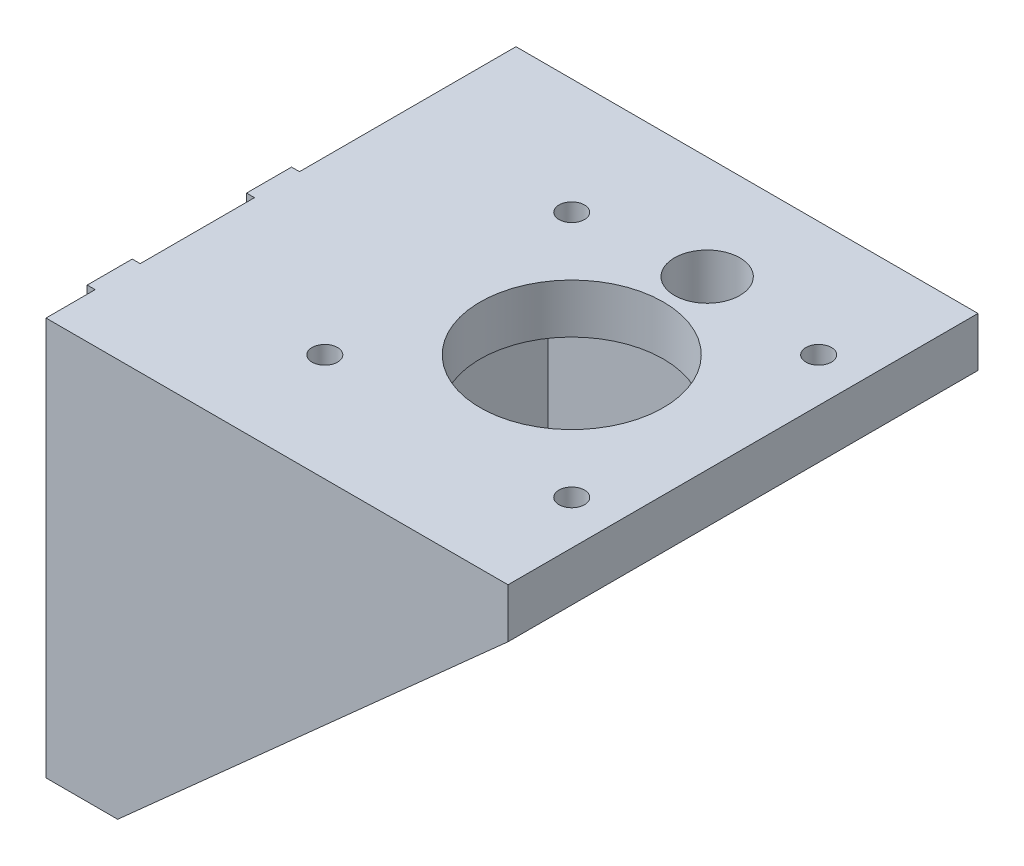
ISO-10303-21;
HEADER;
FILE_DESCRIPTION(('STEP AP214'),'2;1');
FILE_NAME('part.step','',(''),(''),'','','');
FILE_SCHEMA(('AUTOMOTIVE_DESIGN { 1 0 10303 214 1 1 1 1 }'));
ENDSEC;
DATA;
#1=APPLICATION_CONTEXT('core data for automotive mechanical design processes');
#2=APPLICATION_PROTOCOL_DEFINITION('international standard','automotive_design',2000,#1);
#3=PRODUCT_CONTEXT('',#1,'mechanical');
#4=PRODUCT('Part','Part','',(#3));
#5=PRODUCT_RELATED_PRODUCT_CATEGORY('part','',(#4));
#6=PRODUCT_DEFINITION_FORMATION('','',#4);
#7=PRODUCT_DEFINITION_CONTEXT('part definition',#1,'design');
#8=PRODUCT_DEFINITION('design','',#6,#7);
#9=PRODUCT_DEFINITION_SHAPE('','',#8);
#10=(LENGTH_UNIT() NAMED_UNIT(*) SI_UNIT(.MILLI.,.METRE.));
#11=(NAMED_UNIT(*) PLANE_ANGLE_UNIT() SI_UNIT($,.RADIAN.));
#12=(NAMED_UNIT(*) SI_UNIT($,.STERADIAN.) SOLID_ANGLE_UNIT());
#13=UNCERTAINTY_MEASURE_WITH_UNIT(LENGTH_MEASURE(1.E-05),#10,'distance_accuracy_value','');
#14=(GEOMETRIC_REPRESENTATION_CONTEXT(3) GLOBAL_UNCERTAINTY_ASSIGNED_CONTEXT((#13)) GLOBAL_UNIT_ASSIGNED_CONTEXT((#10,
#11,#12)) REPRESENTATION_CONTEXT('',''));
#15=CARTESIAN_POINT('',(0.,0.,0.));
#16=DIRECTION('',(0.,0.,1.));
#17=DIRECTION('',(1.,0.,0.));
#18=AXIS2_PLACEMENT_3D('',#15,#16,#17);
#19=CARTESIAN_POINT('',(0.,11.9,-49.));
#20=DIRECTION('',(1.,0.,0.));
#21=DIRECTION('',(0.,0.,1.));
#22=AXIS2_PLACEMENT_3D('',#19,#20,#21);
#23=CYLINDRICAL_SURFACE('',#22,1.75);
#24=CARTESIAN_POINT('',(-1.,11.9,-49.));
#25=DIRECTION('',(1.,0.,0.));
#26=DIRECTION('',(0.,0.,-1.));
#27=AXIS2_PLACEMENT_3D('',#24,#25,#26);
#28=CIRCLE('',#27,1.75);
#29=CARTESIAN_POINT('',(-1.,11.9,-50.75));
#30=VERTEX_POINT('',#29);
#31=EDGE_CURVE('E176',#30,#30,#28,.F.);
#32=ORIENTED_EDGE('',*,*,#31,.T.);
#33=EDGE_LOOP('',(#32));
#34=FACE_BOUND('',#33,.T.);
#35=CARTESIAN_POINT('',(5.,11.9,-49.));
#36=DIRECTION('',(-1.,0.,0.));
#37=DIRECTION('',(0.,0.,1.));
#38=AXIS2_PLACEMENT_3D('',#35,#36,#37);
#39=CIRCLE('',#38,1.75);
#40=CARTESIAN_POINT('',(5.,11.9,-47.25));
#41=VERTEX_POINT('',#40);
#42=EDGE_CURVE('E43',#41,#41,#39,.F.);
#43=ORIENTED_EDGE('',*,*,#42,.T.);
#44=EDGE_LOOP('',(#43));
#45=FACE_BOUND('',#44,.T.);
#46=ADVANCED_FACE('F39',(#34,#45),#23,.F.);
#47=CARTESIAN_POINT('',(0.,31.9,-49.));
#48=DIRECTION('',(1.,0.,0.));
#49=DIRECTION('',(0.,0.,1.));
#50=AXIS2_PLACEMENT_3D('',#47,#48,#49);
#51=CYLINDRICAL_SURFACE('',#50,1.75);
#52=CARTESIAN_POINT('',(-1.,31.9,-49.));
#53=DIRECTION('',(1.,0.,0.));
#54=DIRECTION('',(0.,0.,-1.));
#55=AXIS2_PLACEMENT_3D('',#52,#53,#54);
#56=CIRCLE('',#55,1.75);
#57=CARTESIAN_POINT('',(-1.,31.9,-50.75));
#58=VERTEX_POINT('',#57);
#59=EDGE_CURVE('E173',#58,#58,#56,.F.);
#60=ORIENTED_EDGE('',*,*,#59,.T.);
#61=EDGE_LOOP('',(#60));
#62=FACE_BOUND('',#61,.T.);
#63=CARTESIAN_POINT('',(5.,31.9,-49.));
#64=DIRECTION('',(-1.,0.,0.));
#65=DIRECTION('',(0.,0.,1.));
#66=AXIS2_PLACEMENT_3D('',#63,#64,#65);
#67=CIRCLE('',#66,1.75);
#68=CARTESIAN_POINT('',(5.,31.9,-47.25));
#69=VERTEX_POINT('',#68);
#70=EDGE_CURVE('E292',#69,#69,#67,.F.);
#71=ORIENTED_EDGE('',*,*,#70,.T.);
#72=EDGE_LOOP('',(#71));
#73=FACE_BOUND('',#72,.T.);
#74=ADVANCED_FACE('F319',(#62,#73),#51,.F.);
#75=CARTESIAN_POINT('',(0.,31.9,-29.));
#76=DIRECTION('',(1.,0.,0.));
#77=DIRECTION('',(0.,0.,1.));
#78=AXIS2_PLACEMENT_3D('',#75,#76,#77);
#79=CYLINDRICAL_SURFACE('',#78,1.75);
#80=CARTESIAN_POINT('',(-1.,31.9,-29.));
#81=DIRECTION('',(1.,0.,0.));
#82=DIRECTION('',(0.,0.,-1.));
#83=AXIS2_PLACEMENT_3D('',#80,#81,#82);
#84=CIRCLE('',#83,1.75);
#85=CARTESIAN_POINT('',(-1.,31.9,-30.75));
#86=VERTEX_POINT('',#85);
#87=EDGE_CURVE('E194',#86,#86,#84,.F.);
#88=ORIENTED_EDGE('',*,*,#87,.T.);
#89=EDGE_LOOP('',(#88));
#90=FACE_BOUND('',#89,.T.);
#91=CARTESIAN_POINT('',(5.,31.9,-29.));
#92=DIRECTION('',(-1.,0.,0.));
#93=DIRECTION('',(0.,0.,1.));
#94=AXIS2_PLACEMENT_3D('',#91,#92,#93);
#95=CIRCLE('',#94,1.75);
#96=CARTESIAN_POINT('',(5.,31.9,-27.25));
#97=VERTEX_POINT('',#96);
#98=EDGE_CURVE('E289',#97,#97,#95,.F.);
#99=ORIENTED_EDGE('',*,*,#98,.T.);
#100=EDGE_LOOP('',(#99));
#101=FACE_BOUND('',#100,.T.);
#102=ADVANCED_FACE('F325',(#90,#101),#79,.F.);
#103=CARTESIAN_POINT('',(0.,11.9,-29.));
#104=DIRECTION('',(1.,0.,0.));
#105=DIRECTION('',(0.,0.,1.));
#106=AXIS2_PLACEMENT_3D('',#103,#104,#105);
#107=CYLINDRICAL_SURFACE('',#106,1.75);
#108=CARTESIAN_POINT('',(-1.,11.9,-29.));
#109=DIRECTION('',(1.,0.,0.));
#110=DIRECTION('',(0.,0.,-1.));
#111=AXIS2_PLACEMENT_3D('',#108,#109,#110);
#112=CIRCLE('',#111,1.75);
#113=CARTESIAN_POINT('',(-1.,11.9,-30.75));
#114=VERTEX_POINT('',#113);
#115=EDGE_CURVE('E191',#114,#114,#112,.F.);
#116=ORIENTED_EDGE('',*,*,#115,.T.);
#117=EDGE_LOOP('',(#116));
#118=FACE_BOUND('',#117,.T.);
#119=CARTESIAN_POINT('',(5.,11.9,-29.));
#120=DIRECTION('',(-1.,0.,0.));
#121=DIRECTION('',(0.,0.,1.));
#122=AXIS2_PLACEMENT_3D('',#119,#120,#121);
#123=CIRCLE('',#122,1.75);
#124=CARTESIAN_POINT('',(5.,11.9,-27.25));
#125=VERTEX_POINT('',#124);
#126=EDGE_CURVE('E286',#125,#125,#123,.F.);
#127=ORIENTED_EDGE('',*,*,#126,.T.);
#128=EDGE_LOOP('',(#127));
#129=FACE_BOUND('',#128,.T.);
#130=ADVANCED_FACE('F331',(#118,#129),#107,.F.);
#131=CARTESIAN_POINT('',(0.,50.,-79.));
#132=DIRECTION('',(1.,0.,0.));
#133=DIRECTION('',(0.,0.,1.));
#134=AXIS2_PLACEMENT_3D('',#131,#132,#133);
#135=PLANE('',#134);
#136=DIRECTION('',(0.,1.,0.));
#137=VECTOR('',#136,1.);
#138=CARTESIAN_POINT('',(0.,0.,-51.825));
#139=LINE('',#138,#137);
#140=CARTESIAN_POINT('',(0.,0.,-51.825));
#141=VERTEX_POINT('',#140);
#142=CARTESIAN_POINT('',(0.,50.,-51.825));
#143=VERTEX_POINT('',#142);
#144=EDGE_CURVE('E168',#141,#143,#139,.T.);
#145=ORIENTED_EDGE('',*,*,#144,.T.);
#146=DIRECTION('',(0.,0.,1.));
#147=VECTOR('',#146,1.);
#148=CARTESIAN_POINT('',(0.,50.,-79.));
#149=LINE('',#148,#147);
#150=CARTESIAN_POINT('',(0.,50.,-79.));
#151=VERTEX_POINT('',#150);
#152=EDGE_CURVE('E265',#151,#143,#149,.T.);
#153=ORIENTED_EDGE('',*,*,#152,.F.);
#154=DIRECTION('',(0.,-1.,0.));
#155=VECTOR('',#154,1.);
#156=CARTESIAN_POINT('',(0.,50.,-79.));
#157=LINE('',#156,#155);
#158=CARTESIAN_POINT('',(0.,0.,-79.));
#159=VERTEX_POINT('',#158);
#160=EDGE_CURVE('E238',#151,#159,#157,.T.);
#161=ORIENTED_EDGE('',*,*,#160,.T.);
#162=DIRECTION('',(0.,0.,1.));
#163=VECTOR('',#162,1.);
#164=CARTESIAN_POINT('',(0.,0.,-79.));
#165=LINE('',#164,#163);
#166=EDGE_CURVE('E281',#159,#141,#165,.T.);
#167=ORIENTED_EDGE('',*,*,#166,.T.);
#168=EDGE_LOOP('',(#145,#153,#161,#167));
#169=FACE_BOUND('',#168,.T.);
#170=ADVANCED_FACE('F380',(#169),#135,.F.);
#171=DIRECTION('',(0.,-1.,0.));
#172=VECTOR('',#171,1.);
#173=CARTESIAN_POINT('',(0.,0.,-46.175));
#174=LINE('',#173,#172);
#175=CARTESIAN_POINT('',(0.,50.,-46.175));
#176=VERTEX_POINT('',#175);
#177=CARTESIAN_POINT('',(0.,0.,-46.175));
#178=VERTEX_POINT('',#177);
#179=EDGE_CURVE('E184',#176,#178,#174,.T.);
#180=ORIENTED_EDGE('',*,*,#179,.T.);
#181=CARTESIAN_POINT('',(0.,0.,-31.825));
#182=VERTEX_POINT('',#181);
#183=EDGE_CURVE('E283',#178,#182,#165,.T.);
#184=ORIENTED_EDGE('',*,*,#183,.T.);
#185=DIRECTION('',(0.,1.,0.));
#186=VECTOR('',#185,1.);
#187=CARTESIAN_POINT('',(0.,0.,-31.825));
#188=LINE('',#187,#186);
#189=CARTESIAN_POINT('',(0.,50.,-31.825));
#190=VERTEX_POINT('',#189);
#191=EDGE_CURVE('E169',#182,#190,#188,.T.);
#192=ORIENTED_EDGE('',*,*,#191,.T.);
#193=EDGE_CURVE('E269',#176,#190,#149,.T.);
#194=ORIENTED_EDGE('',*,*,#193,.F.);
#195=EDGE_LOOP('',(#180,#184,#192,#194));
#196=FACE_BOUND('',#195,.T.);
#197=ADVANCED_FACE('F378',(#196),#135,.F.);
#198=DIRECTION('',(0.,-1.,0.));
#199=VECTOR('',#198,1.);
#200=CARTESIAN_POINT('',(0.,0.,-26.175));
#201=LINE('',#200,#199);
#202=CARTESIAN_POINT('',(0.,50.,-26.175));
#203=VERTEX_POINT('',#202);
#204=CARTESIAN_POINT('',(0.,0.,-26.175));
#205=VERTEX_POINT('',#204);
#206=EDGE_CURVE('E195',#203,#205,#201,.T.);
#207=ORIENTED_EDGE('',*,*,#206,.T.);
#208=CARTESIAN_POINT('',(0.,0.,-20.));
#209=VERTEX_POINT('',#208);
#210=EDGE_CURVE('E280',#205,#209,#165,.T.);
#211=ORIENTED_EDGE('',*,*,#210,.T.);
#212=DIRECTION('',(0.,-1.,0.));
#213=VECTOR('',#212,1.);
#214=CARTESIAN_POINT('',(0.,50.,-20.));
#215=LINE('',#214,#213);
#216=CARTESIAN_POINT('',(0.,50.,-20.));
#217=VERTEX_POINT('',#216);
#218=EDGE_CURVE('E237',#217,#209,#215,.T.);
#219=ORIENTED_EDGE('',*,*,#218,.F.);
#220=EDGE_CURVE('E252',#203,#217,#149,.T.);
#221=ORIENTED_EDGE('',*,*,#220,.F.);
#222=EDGE_LOOP('',(#207,#211,#219,#221));
#223=FACE_BOUND('',#222,.T.);
#224=ADVANCED_FACE('F41',(#223),#135,.F.);
#225=CARTESIAN_POINT('',(8.99999999999999,0.,-79.));
#226=DIRECTION('',(-0.666438974816623,0.745559583698961,0.));
#227=DIRECTION('',(-0.745559583698961,-0.666438974816623,0.));
#228=AXIS2_PLACEMENT_3D('',#225,#226,#227);
#229=PLANE('',#228);
#230=DIRECTION('',(0.,0.,1.));
#231=VECTOR('',#230,1.);
#232=CARTESIAN_POINT('',(8.99999999999999,0.,-79.));
#233=LINE('',#232,#231);
#234=CARTESIAN_POINT('',(8.99999999999999,0.,-79.));
#235=VERTEX_POINT('',#234);
#236=CARTESIAN_POINT('',(8.99999999999999,0.,-74.));
#237=VERTEX_POINT('',#236);
#238=EDGE_CURVE('E277',#235,#237,#233,.T.);
#239=ORIENTED_EDGE('',*,*,#238,.F.);
#240=DIRECTION('',(0.745559583698961,0.666438974816623,0.));
#241=VECTOR('',#240,1.);
#242=CARTESIAN_POINT('',(8.99999999999999,0.,-79.));
#243=LINE('',#242,#241);
#244=CARTESIAN_POINT('',(58.,43.8,-79.));
#245=VERTEX_POINT('',#244);
#246=EDGE_CURVE('E244',#235,#245,#243,.T.);
#247=ORIENTED_EDGE('',*,*,#246,.T.);
#248=DIRECTION('',(0.,0.,1.));
#249=VECTOR('',#248,1.);
#250=CARTESIAN_POINT('',(58.,43.8,-79.));
#251=LINE('',#250,#249);
#252=CARTESIAN_POINT('',(58.,43.8,-74.));
#253=VERTEX_POINT('',#252);
#254=EDGE_CURVE('E273',#245,#253,#251,.T.);
#255=ORIENTED_EDGE('',*,*,#254,.T.);
#256=DIRECTION('',(0.745559583698961,0.666438974816623,0.));
#257=VECTOR('',#256,1.);
#258=CARTESIAN_POINT('',(8.99999999999999,0.,-74.));
#259=LINE('',#258,#257);
#260=EDGE_CURVE('E12',#237,#253,#259,.T.);
#261=ORIENTED_EDGE('',*,*,#260,.F.);
#262=EDGE_LOOP('',(#239,#247,#255,#261));
#263=FACE_BOUND('',#262,.T.);
#264=ADVANCED_FACE('F369',(#263),#229,.F.);
#265=CARTESIAN_POINT('',(0.,0.,-79.));
#266=DIRECTION('',(0.,1.,0.));
#267=DIRECTION('',(0.,0.,-1.));
#268=AXIS2_PLACEMENT_3D('',#265,#266,#267);
#269=PLANE('',#268);
#270=DIRECTION('',(1.,0.,0.));
#271=VECTOR('',#270,1.);
#272=CARTESIAN_POINT('',(0.,0.,-20.));
#273=LINE('',#272,#271);
#274=CARTESIAN_POINT('',(8.99999999999999,0.,-20.));
#275=VERTEX_POINT('',#274);
#276=EDGE_CURVE('E255',#209,#275,#273,.T.);
#277=ORIENTED_EDGE('',*,*,#276,.F.);
#278=ORIENTED_EDGE('',*,*,#210,.F.);
#279=DIRECTION('',(1.,0.,0.));
#280=VECTOR('',#279,1.);
#281=CARTESIAN_POINT('',(-1.,0.,-26.175));
#282=LINE('',#281,#280);
#283=CARTESIAN_POINT('',(-1.,0.,-26.175));
#284=VERTEX_POINT('',#283);
#285=EDGE_CURVE('E208',#284,#205,#282,.T.);
#286=ORIENTED_EDGE('',*,*,#285,.F.);
#287=DIRECTION('',(0.,0.,-1.));
#288=VECTOR('',#287,1.);
#289=CARTESIAN_POINT('',(-1.,0.,-20.));
#290=LINE('',#289,#288);
#291=CARTESIAN_POINT('',(-1.,0.,-31.825));
#292=VERTEX_POINT('',#291);
#293=EDGE_CURVE('E198',#284,#292,#290,.T.);
#294=ORIENTED_EDGE('',*,*,#293,.T.);
#295=DIRECTION('',(1.,0.,0.));
#296=VECTOR('',#295,1.);
#297=CARTESIAN_POINT('',(-1.,0.,-31.825));
#298=LINE('',#297,#296);
#299=EDGE_CURVE('E218',#292,#182,#298,.T.);
#300=ORIENTED_EDGE('',*,*,#299,.T.);
#301=ORIENTED_EDGE('',*,*,#183,.F.);
#302=DIRECTION('',(1.,0.,0.));
#303=VECTOR('',#302,1.);
#304=CARTESIAN_POINT('',(-1.,0.,-46.175));
#305=LINE('',#304,#303);
#306=CARTESIAN_POINT('',(-1.,0.,-46.175));
#307=VERTEX_POINT('',#306);
#308=EDGE_CURVE('E56',#307,#178,#305,.T.);
#309=ORIENTED_EDGE('',*,*,#308,.F.);
#310=DIRECTION('',(0.,0.,-1.));
#311=VECTOR('',#310,1.);
#312=CARTESIAN_POINT('',(-1.,0.,-20.));
#313=LINE('',#312,#311);
#314=CARTESIAN_POINT('',(-1.,0.,-51.825));
#315=VERTEX_POINT('',#314);
#316=EDGE_CURVE('E159',#307,#315,#313,.T.);
#317=ORIENTED_EDGE('',*,*,#316,.T.);
#318=DIRECTION('',(1.,0.,0.));
#319=VECTOR('',#318,1.);
#320=CARTESIAN_POINT('',(-1.,0.,-51.825));
#321=LINE('',#320,#319);
#322=EDGE_CURVE('E64',#315,#141,#321,.T.);
#323=ORIENTED_EDGE('',*,*,#322,.T.);
#324=ORIENTED_EDGE('',*,*,#166,.F.);
#325=DIRECTION('',(1.,0.,0.));
#326=VECTOR('',#325,1.);
#327=CARTESIAN_POINT('',(0.,0.,-79.));
#328=LINE('',#327,#326);
#329=EDGE_CURVE('E241',#159,#235,#328,.T.);
#330=ORIENTED_EDGE('',*,*,#329,.T.);
#331=ORIENTED_EDGE('',*,*,#238,.T.);
#332=DIRECTION('',(0.,0.,-1.));
#333=VECTOR('',#332,1.);
#334=CARTESIAN_POINT('',(8.99999999999999,0.,-24.));
#335=LINE('',#334,#333);
#336=CARTESIAN_POINT('',(8.99999999999997,0.,-24.));
#337=VERTEX_POINT('',#336);
#338=EDGE_CURVE('E229',#337,#237,#335,.T.);
#339=ORIENTED_EDGE('',*,*,#338,.F.);
#340=EDGE_CURVE('E276',#337,#275,#233,.T.);
#341=ORIENTED_EDGE('',*,*,#340,.T.);
#342=EDGE_LOOP('',(#277,#278,#286,#294,#300,#301,#309,#317,#323,#324,#330,#331,#339,#341));
#343=FACE_BOUND('',#342,.T.);
#344=ADVANCED_FACE('F172',(#343),#269,.F.);
#345=CARTESIAN_POINT('',(58.,43.8,-24.));
#346=VERTEX_POINT('',#345);
#347=CARTESIAN_POINT('',(58.,43.8,-20.));
#348=VERTEX_POINT('',#347);
#349=EDGE_CURVE('E272',#346,#348,#251,.T.);
#350=ORIENTED_EDGE('',*,*,#349,.T.);
#351=DIRECTION('',(0.745559583698961,0.666438974816623,0.));
#352=VECTOR('',#351,1.);
#353=CARTESIAN_POINT('',(8.99999999999999,0.,-20.));
#354=LINE('',#353,#352);
#355=EDGE_CURVE('E258',#275,#348,#354,.T.);
#356=ORIENTED_EDGE('',*,*,#355,.F.);
#357=ORIENTED_EDGE('',*,*,#340,.F.);
#358=DIRECTION('',(-0.745559583698961,-0.666438974816623,0.));
#359=VECTOR('',#358,1.);
#360=CARTESIAN_POINT('',(9.,0.,-24.));
#361=LINE('',#360,#359);
#362=EDGE_CURVE('E48',#346,#337,#361,.T.);
#363=ORIENTED_EDGE('',*,*,#362,.F.);
#364=EDGE_LOOP('',(#350,#356,#357,#363));
#365=FACE_BOUND('',#364,.T.);
#366=ADVANCED_FACE('F365',(#365),#229,.F.);
#367=CARTESIAN_POINT('',(58.,50.,-79.));
#368=DIRECTION('',(-1.,0.,0.));
#369=DIRECTION('',(0.,0.,-1.));
#370=AXIS2_PLACEMENT_3D('',#367,#368,#369);
#371=PLANE('',#370);
#372=DIRECTION('',(0.,1.,0.));
#373=VECTOR('',#372,1.);
#374=CARTESIAN_POINT('',(58.,50.,-20.));
#375=LINE('',#374,#373);
#376=CARTESIAN_POINT('',(58.,50.,-20.));
#377=VERTEX_POINT('',#376);
#378=EDGE_CURVE('E261',#348,#377,#375,.T.);
#379=ORIENTED_EDGE('',*,*,#378,.F.);
#380=ORIENTED_EDGE('',*,*,#349,.F.);
#381=DIRECTION('',(0.,0.,-1.));
#382=VECTOR('',#381,1.);
#383=CARTESIAN_POINT('',(58.,43.8,-74.));
#384=LINE('',#383,#382);
#385=EDGE_CURVE('E220',#346,#253,#384,.T.);
#386=ORIENTED_EDGE('',*,*,#385,.T.);
#387=ORIENTED_EDGE('',*,*,#254,.F.);
#388=DIRECTION('',(0.,1.,0.));
#389=VECTOR('',#388,1.);
#390=CARTESIAN_POINT('',(58.,50.,-79.));
#391=LINE('',#390,#389);
#392=CARTESIAN_POINT('',(58.,50.,-79.));
#393=VERTEX_POINT('',#392);
#394=EDGE_CURVE('E247',#245,#393,#391,.T.);
#395=ORIENTED_EDGE('',*,*,#394,.T.);
#396=DIRECTION('',(0.,0.,1.));
#397=VECTOR('',#396,1.);
#398=CARTESIAN_POINT('',(58.,50.,-79.));
#399=LINE('',#398,#397);
#400=EDGE_CURVE('E268',#393,#377,#399,.T.);
#401=ORIENTED_EDGE('',*,*,#400,.T.);
#402=EDGE_LOOP('',(#379,#380,#386,#387,#395,#401));
#403=FACE_BOUND('',#402,.T.);
#404=ADVANCED_FACE('F361',(#403),#371,.F.);
#405=CARTESIAN_POINT('',(0.,50.,-79.));
#406=DIRECTION('',(0.,-1.,0.));
#407=DIRECTION('',(0.,0.,1.));
#408=AXIS2_PLACEMENT_3D('',#405,#406,#407);
#409=PLANE('',#408);
#410=CARTESIAN_POINT('',(21.5,50.,-33.5));
#411=DIRECTION('',(0.,-1.,0.));
#412=DIRECTION('',(0.,0.,-1.));
#413=AXIS2_PLACEMENT_3D('',#410,#411,#412);
#414=CIRCLE('',#413,1.6);
#415=CARTESIAN_POINT('',(21.5,50.,-35.1));
#416=VERTEX_POINT('',#415);
#417=EDGE_CURVE('E503',#416,#416,#414,.T.);
#418=ORIENTED_EDGE('',*,*,#417,.T.);
#419=EDGE_LOOP('',(#418));
#420=FACE_BOUND('',#419,.T.);
#421=CARTESIAN_POINT('',(52.5,50.,-33.5));
#422=DIRECTION('',(0.,-1.,0.));
#423=DIRECTION('',(0.,0.,-1.));
#424=AXIS2_PLACEMENT_3D('',#421,#422,#423);
#425=CIRCLE('',#424,1.6);
#426=CARTESIAN_POINT('',(52.5,50.,-35.1));
#427=VERTEX_POINT('',#426);
#428=EDGE_CURVE('E511',#427,#427,#425,.T.);
#429=ORIENTED_EDGE('',*,*,#428,.T.);
#430=EDGE_LOOP('',(#429));
#431=FACE_BOUND('',#430,.T.);
#432=CARTESIAN_POINT('',(52.5,50.,-64.5));
#433=DIRECTION('',(0.,-1.,0.));
#434=DIRECTION('',(0.,0.,-1.));
#435=AXIS2_PLACEMENT_3D('',#432,#433,#434);
#436=CIRCLE('',#435,1.6);
#437=CARTESIAN_POINT('',(52.5,50.,-66.1));
#438=VERTEX_POINT('',#437);
#439=EDGE_CURVE('E517',#438,#438,#436,.T.);
#440=ORIENTED_EDGE('',*,*,#439,.T.);
#441=EDGE_LOOP('',(#440));
#442=FACE_BOUND('',#441,.T.);
#443=CARTESIAN_POINT('',(21.5,50.,-64.5));
#444=DIRECTION('',(0.,-1.,0.));
#445=DIRECTION('',(0.,0.,-1.));
#446=AXIS2_PLACEMENT_3D('',#443,#444,#445);
#447=CIRCLE('',#446,1.6);
#448=CARTESIAN_POINT('',(21.5,50.,-66.1));
#449=VERTEX_POINT('',#448);
#450=EDGE_CURVE('E500',#449,#449,#447,.T.);
#451=ORIENTED_EDGE('',*,*,#450,.T.);
#452=EDGE_LOOP('',(#451));
#453=FACE_BOUND('',#452,.T.);
#454=CARTESIAN_POINT('',(37.,50.,-66.));
#455=DIRECTION('',(0.,-1.,0.));
#456=DIRECTION('',(0.,0.,-1.));
#457=AXIS2_PLACEMENT_3D('',#454,#455,#456);
#458=CIRCLE('',#457,4.1);
#459=CARTESIAN_POINT('',(37.,50.,-70.1));
#460=VERTEX_POINT('',#459);
#461=EDGE_CURVE('E497',#460,#460,#458,.T.);
#462=ORIENTED_EDGE('',*,*,#461,.T.);
#463=EDGE_LOOP('',(#462));
#464=FACE_BOUND('',#463,.T.);
#465=CARTESIAN_POINT('',(37.,50.,-49.));
#466=DIRECTION('',(0.,-1.,0.));
#467=DIRECTION('',(0.,0.,-1.));
#468=AXIS2_PLACEMENT_3D('',#465,#466,#467);
#469=CIRCLE('',#468,11.5);
#470=CARTESIAN_POINT('',(37.,50.,-60.5));
#471=VERTEX_POINT('',#470);
#472=EDGE_CURVE('E510',#471,#471,#469,.T.);
#473=ORIENTED_EDGE('',*,*,#472,.T.);
#474=EDGE_LOOP('',(#473));
#475=FACE_BOUND('',#474,.T.);
#476=DIRECTION('',(-1.,0.,0.));
#477=VECTOR('',#476,1.);
#478=CARTESIAN_POINT('',(0.,50.,-20.));
#479=LINE('',#478,#477);
#480=EDGE_CURVE('E242',#377,#217,#479,.T.);
#481=ORIENTED_EDGE('',*,*,#480,.F.);
#482=ORIENTED_EDGE('',*,*,#400,.F.);
#483=DIRECTION('',(-1.,0.,0.));
#484=VECTOR('',#483,1.);
#485=CARTESIAN_POINT('',(0.,50.,-79.));
#486=LINE('',#485,#484);
#487=EDGE_CURVE('E250',#393,#151,#486,.T.);
#488=ORIENTED_EDGE('',*,*,#487,.T.);
#489=ORIENTED_EDGE('',*,*,#152,.T.);
#490=DIRECTION('',(1.,0.,0.));
#491=VECTOR('',#490,1.);
#492=CARTESIAN_POINT('',(-1.,50.,-51.825));
#493=LINE('',#492,#491);
#494=CARTESIAN_POINT('',(-1.,50.,-51.825));
#495=VERTEX_POINT('',#494);
#496=EDGE_CURVE('E170',#495,#143,#493,.T.);
#497=ORIENTED_EDGE('',*,*,#496,.F.);
#498=DIRECTION('',(0.,0.,1.));
#499=VECTOR('',#498,1.);
#500=CARTESIAN_POINT('',(-1.,50.,-20.));
#501=LINE('',#500,#499);
#502=CARTESIAN_POINT('',(-1.,50.,-46.175));
#503=VERTEX_POINT('',#502);
#504=EDGE_CURVE('E161',#495,#503,#501,.T.);
#505=ORIENTED_EDGE('',*,*,#504,.T.);
#506=DIRECTION('',(1.,0.,0.));
#507=VECTOR('',#506,1.);
#508=CARTESIAN_POINT('',(-1.,50.,-46.175));
#509=LINE('',#508,#507);
#510=EDGE_CURVE('E188',#503,#176,#509,.T.);
#511=ORIENTED_EDGE('',*,*,#510,.T.);
#512=ORIENTED_EDGE('',*,*,#193,.T.);
#513=DIRECTION('',(1.,0.,0.));
#514=VECTOR('',#513,1.);
#515=CARTESIAN_POINT('',(-1.,50.,-31.825));
#516=LINE('',#515,#514);
#517=CARTESIAN_POINT('',(-1.,50.,-31.825));
#518=VERTEX_POINT('',#517);
#519=EDGE_CURVE('E216',#518,#190,#516,.T.);
#520=ORIENTED_EDGE('',*,*,#519,.F.);
#521=DIRECTION('',(0.,0.,1.));
#522=VECTOR('',#521,1.);
#523=CARTESIAN_POINT('',(-1.,50.,-20.));
#524=LINE('',#523,#522);
#525=CARTESIAN_POINT('',(-1.,50.,-26.175));
#526=VERTEX_POINT('',#525);
#527=EDGE_CURVE('E203',#518,#526,#524,.T.);
#528=ORIENTED_EDGE('',*,*,#527,.T.);
#529=DIRECTION('',(1.,0.,0.));
#530=VECTOR('',#529,1.);
#531=CARTESIAN_POINT('',(-1.,50.,-26.175));
#532=LINE('',#531,#530);
#533=EDGE_CURVE('E214',#526,#203,#532,.T.);
#534=ORIENTED_EDGE('',*,*,#533,.T.);
#535=ORIENTED_EDGE('',*,*,#220,.T.);
#536=EDGE_LOOP('',(#481,#482,#488,#489,#497,#505,#511,#512,#520,#528,#534,#535));
#537=FACE_BOUND('',#536,.T.);
#538=ADVANCED_FACE('F354',(#420,#431,#442,#453,#464,#475,#537),#409,.F.);
#539=CARTESIAN_POINT('',(0.,0.,-79.));
#540=DIRECTION('',(0.,0.,-1.));
#541=DIRECTION('',(1.,0.,0.));
#542=AXIS2_PLACEMENT_3D('',#539,#540,#541);
#543=PLANE('',#542);
#544=ORIENTED_EDGE('',*,*,#160,.F.);
#545=ORIENTED_EDGE('',*,*,#487,.F.);
#546=ORIENTED_EDGE('',*,*,#394,.F.);
#547=ORIENTED_EDGE('',*,*,#246,.F.);
#548=ORIENTED_EDGE('',*,*,#329,.F.);
#549=EDGE_LOOP('',(#544,#545,#546,#547,#548));
#550=FACE_BOUND('',#549,.T.);
#551=ADVANCED_FACE('F351',(#550),#543,.T.);
#552=CARTESIAN_POINT('',(0.,0.,-20.));
#553=DIRECTION('',(0.,0.,-1.));
#554=DIRECTION('',(1.,0.,0.));
#555=AXIS2_PLACEMENT_3D('',#552,#553,#554);
#556=PLANE('',#555);
#557=ORIENTED_EDGE('',*,*,#218,.T.);
#558=ORIENTED_EDGE('',*,*,#276,.T.);
#559=ORIENTED_EDGE('',*,*,#355,.T.);
#560=ORIENTED_EDGE('',*,*,#378,.T.);
#561=ORIENTED_EDGE('',*,*,#480,.T.);
#562=EDGE_LOOP('',(#557,#558,#559,#560,#561));
#563=FACE_BOUND('',#562,.T.);
#564=ADVANCED_FACE('F349',(#563),#556,.F.);
#565=CARTESIAN_POINT('',(-66.4713472106591,0.,-74.));
#566=DIRECTION('',(0.,0.,-1.));
#567=DIRECTION('',(1.,0.,0.));
#568=AXIS2_PLACEMENT_3D('',#565,#566,#567);
#569=PLANE('',#568);
#570=DIRECTION('',(0.,1.,0.));
#571=VECTOR('',#570,1.);
#572=CARTESIAN_POINT('',(8.99999999999999,0.,-74.));
#573=LINE('',#572,#571);
#574=CARTESIAN_POINT('',(8.99999999999999,43.8,-74.));
#575=VERTEX_POINT('',#574);
#576=EDGE_CURVE('E226',#237,#575,#573,.T.);
#577=ORIENTED_EDGE('',*,*,#576,.F.);
#578=ORIENTED_EDGE('',*,*,#260,.T.);
#579=DIRECTION('',(1.,0.,0.));
#580=VECTOR('',#579,1.);
#581=CARTESIAN_POINT('',(-66.4713472106591,43.8,-74.));
#582=LINE('',#581,#580);
#583=EDGE_CURVE('E224',#575,#253,#582,.T.);
#584=ORIENTED_EDGE('',*,*,#583,.F.);
#585=EDGE_LOOP('',(#577,#578,#584));
#586=FACE_BOUND('',#585,.T.);
#587=ADVANCED_FACE('F345',(#586),#569,.F.);
#588=CARTESIAN_POINT('',(-66.4713472106591,43.8,-24.));
#589=DIRECTION('',(0.,0.,1.));
#590=DIRECTION('',(0.,1.,0.));
#591=AXIS2_PLACEMENT_3D('',#588,#589,#590);
#592=PLANE('',#591);
#593=DIRECTION('',(1.,0.,0.));
#594=VECTOR('',#593,1.);
#595=CARTESIAN_POINT('',(-66.4713472106591,43.8,-24.));
#596=LINE('',#595,#594);
#597=CARTESIAN_POINT('',(8.99999999999999,43.8,-24.));
#598=VERTEX_POINT('',#597);
#599=EDGE_CURVE('E232',#598,#346,#596,.T.);
#600=ORIENTED_EDGE('',*,*,#599,.T.);
#601=ORIENTED_EDGE('',*,*,#362,.T.);
#602=DIRECTION('',(0.,-1.,0.));
#603=VECTOR('',#602,1.);
#604=CARTESIAN_POINT('',(8.99999999999999,43.8,-24.));
#605=LINE('',#604,#603);
#606=EDGE_CURVE('E221',#598,#337,#605,.T.);
#607=ORIENTED_EDGE('',*,*,#606,.F.);
#608=EDGE_LOOP('',(#600,#601,#607));
#609=FACE_BOUND('',#608,.T.);
#610=ADVANCED_FACE('F341',(#609),#592,.F.);
#611=CARTESIAN_POINT('',(-66.4713472106591,43.8,-74.));
#612=DIRECTION('',(0.,1.,0.));
#613=DIRECTION('',(0.,0.,-1.));
#614=AXIS2_PLACEMENT_3D('',#611,#612,#613);
#615=PLANE('',#614);
#616=CARTESIAN_POINT('',(21.5,43.8,-33.5));
#617=DIRECTION('',(0.,-1.,0.));
#618=DIRECTION('',(0.,0.,-1.));
#619=AXIS2_PLACEMENT_3D('',#616,#617,#618);
#620=CIRCLE('',#619,1.6);
#621=CARTESIAN_POINT('',(21.5,43.8,-35.1));
#622=VERTEX_POINT('',#621);
#623=EDGE_CURVE('E506',#622,#622,#620,.F.);
#624=ORIENTED_EDGE('',*,*,#623,.T.);
#625=EDGE_LOOP('',(#624));
#626=FACE_BOUND('',#625,.T.);
#627=CARTESIAN_POINT('',(52.5,43.8,-33.5));
#628=DIRECTION('',(0.,-1.,0.));
#629=DIRECTION('',(0.,0.,-1.));
#630=AXIS2_PLACEMENT_3D('',#627,#628,#629);
#631=CIRCLE('',#630,1.6);
#632=CARTESIAN_POINT('',(52.5,43.8,-35.1));
#633=VERTEX_POINT('',#632);
#634=EDGE_CURVE('E507',#633,#633,#631,.F.);
#635=ORIENTED_EDGE('',*,*,#634,.T.);
#636=EDGE_LOOP('',(#635));
#637=FACE_BOUND('',#636,.T.);
#638=CARTESIAN_POINT('',(52.5,43.8,-64.5));
#639=DIRECTION('',(0.,-1.,0.));
#640=DIRECTION('',(0.,0.,-1.));
#641=AXIS2_PLACEMENT_3D('',#638,#639,#640);
#642=CIRCLE('',#641,1.6);
#643=CARTESIAN_POINT('',(52.5,43.8,-66.1));
#644=VERTEX_POINT('',#643);
#645=EDGE_CURVE('E514',#644,#644,#642,.F.);
#646=ORIENTED_EDGE('',*,*,#645,.T.);
#647=EDGE_LOOP('',(#646));
#648=FACE_BOUND('',#647,.T.);
#649=CARTESIAN_POINT('',(21.5,43.8,-64.5));
#650=DIRECTION('',(0.,-1.,0.));
#651=DIRECTION('',(0.,0.,-1.));
#652=AXIS2_PLACEMENT_3D('',#649,#650,#651);
#653=CIRCLE('',#652,1.6);
#654=CARTESIAN_POINT('',(21.5,43.8,-66.1));
#655=VERTEX_POINT('',#654);
#656=EDGE_CURVE('E520',#655,#655,#653,.F.);
#657=ORIENTED_EDGE('',*,*,#656,.T.);
#658=EDGE_LOOP('',(#657));
#659=FACE_BOUND('',#658,.T.);
#660=CARTESIAN_POINT('',(37.,43.8,-66.));
#661=DIRECTION('',(0.,-1.,0.));
#662=DIRECTION('',(0.,0.,-1.));
#663=AXIS2_PLACEMENT_3D('',#660,#661,#662);
#664=CIRCLE('',#663,4.1);
#665=CARTESIAN_POINT('',(37.,43.8,-70.1));
#666=VERTEX_POINT('',#665);
#667=EDGE_CURVE('E494',#666,#666,#664,.F.);
#668=ORIENTED_EDGE('',*,*,#667,.T.);
#669=EDGE_LOOP('',(#668));
#670=FACE_BOUND('',#669,.T.);
#671=CARTESIAN_POINT('',(37.,43.8,-49.));
#672=DIRECTION('',(0.,-1.,0.));
#673=DIRECTION('',(0.,0.,-1.));
#674=AXIS2_PLACEMENT_3D('',#671,#672,#673);
#675=CIRCLE('',#674,11.5);
#676=CARTESIAN_POINT('',(37.,43.8,-60.5));
#677=VERTEX_POINT('',#676);
#678=EDGE_CURVE('E529',#677,#677,#675,.F.);
#679=ORIENTED_EDGE('',*,*,#678,.T.);
#680=EDGE_LOOP('',(#679));
#681=FACE_BOUND('',#680,.T.);
#682=DIRECTION('',(0.,0.,1.));
#683=VECTOR('',#682,1.);
#684=CARTESIAN_POINT('',(8.99999999999999,43.8,-74.));
#685=LINE('',#684,#683);
#686=EDGE_CURVE('E223',#575,#598,#685,.T.);
#687=ORIENTED_EDGE('',*,*,#686,.F.);
#688=ORIENTED_EDGE('',*,*,#583,.T.);
#689=ORIENTED_EDGE('',*,*,#385,.F.);
#690=ORIENTED_EDGE('',*,*,#599,.F.);
#691=EDGE_LOOP('',(#687,#688,#689,#690));
#692=FACE_BOUND('',#691,.T.);
#693=ADVANCED_FACE('F337',(#626,#637,#648,#659,#670,#681,#692),#615,.F.);
#694=CARTESIAN_POINT('',(9.,50.,-79.));
#695=DIRECTION('',(1.,0.,0.));
#696=DIRECTION('',(0.,0.,1.));
#697=AXIS2_PLACEMENT_3D('',#694,#695,#696);
#698=PLANE('',#697);
#699=CARTESIAN_POINT('',(9.,31.9,-29.));
#700=DIRECTION('',(-1.,0.,0.));
#701=DIRECTION('',(0.,0.,1.));
#702=AXIS2_PLACEMENT_3D('',#699,#700,#701);
#703=CIRCLE('',#702,4.35);
#704=CARTESIAN_POINT('',(9.,31.9,-24.65));
#705=VERTEX_POINT('',#704);
#706=EDGE_CURVE('E543',#705,#705,#703,.T.);
#707=ORIENTED_EDGE('',*,*,#706,.T.);
#708=EDGE_LOOP('',(#707));
#709=FACE_BOUND('',#708,.T.);
#710=CARTESIAN_POINT('',(9.,11.9,-49.));
#711=DIRECTION('',(-1.,0.,0.));
#712=DIRECTION('',(0.,0.,1.));
#713=AXIS2_PLACEMENT_3D('',#710,#711,#712);
#714=CIRCLE('',#713,4.35);
#715=CARTESIAN_POINT('',(9.,11.9,-44.65));
#716=VERTEX_POINT('',#715);
#717=EDGE_CURVE('E536',#716,#716,#714,.T.);
#718=ORIENTED_EDGE('',*,*,#717,.T.);
#719=EDGE_LOOP('',(#718));
#720=FACE_BOUND('',#719,.T.);
#721=CARTESIAN_POINT('',(9.,11.9,-29.));
#722=DIRECTION('',(-1.,0.,0.));
#723=DIRECTION('',(0.,0.,1.));
#724=AXIS2_PLACEMENT_3D('',#721,#722,#723);
#725=CIRCLE('',#724,4.35);
#726=CARTESIAN_POINT('',(9.,11.9,-24.65));
#727=VERTEX_POINT('',#726);
#728=EDGE_CURVE('E532',#727,#727,#725,.T.);
#729=ORIENTED_EDGE('',*,*,#728,.T.);
#730=EDGE_LOOP('',(#729));
#731=FACE_BOUND('',#730,.T.);
#732=CARTESIAN_POINT('',(9.,31.9,-49.));
#733=DIRECTION('',(-1.,0.,0.));
#734=DIRECTION('',(0.,0.,1.));
#735=AXIS2_PLACEMENT_3D('',#732,#733,#734);
#736=CIRCLE('',#735,4.35);
#737=CARTESIAN_POINT('',(9.,31.9,-44.65));
#738=VERTEX_POINT('',#737);
#739=EDGE_CURVE('E542',#738,#738,#736,.T.);
#740=ORIENTED_EDGE('',*,*,#739,.T.);
#741=EDGE_LOOP('',(#740));
#742=FACE_BOUND('',#741,.T.);
#743=ORIENTED_EDGE('',*,*,#576,.T.);
#744=ORIENTED_EDGE('',*,*,#686,.T.);
#745=ORIENTED_EDGE('',*,*,#606,.T.);
#746=ORIENTED_EDGE('',*,*,#338,.T.);
#747=EDGE_LOOP('',(#743,#744,#745,#746));
#748=FACE_BOUND('',#747,.T.);
#749=ADVANCED_FACE('F333',(#709,#720,#731,#742,#748),#698,.T.);
#750=CARTESIAN_POINT('',(-1.,0.,-31.825));
#751=DIRECTION('',(0.,0.,1.));
#752=DIRECTION('',(0.,1.,0.));
#753=AXIS2_PLACEMENT_3D('',#750,#751,#752);
#754=PLANE('',#753);
#755=ORIENTED_EDGE('',*,*,#191,.F.);
#756=ORIENTED_EDGE('',*,*,#299,.F.);
#757=DIRECTION('',(0.,1.,0.));
#758=VECTOR('',#757,1.);
#759=CARTESIAN_POINT('',(-1.,0.,-31.825));
#760=LINE('',#759,#758);
#761=EDGE_CURVE('E201',#292,#518,#760,.T.);
#762=ORIENTED_EDGE('',*,*,#761,.T.);
#763=ORIENTED_EDGE('',*,*,#519,.T.);
#764=EDGE_LOOP('',(#755,#756,#762,#763));
#765=FACE_BOUND('',#764,.T.);
#766=ADVANCED_FACE('F336',(#765),#754,.F.);
#767=CARTESIAN_POINT('',(-1.,0.,-26.175));
#768=DIRECTION('',(0.,0.,-1.));
#769=DIRECTION('',(0.,-1.,0.));
#770=AXIS2_PLACEMENT_3D('',#767,#768,#769);
#771=PLANE('',#770);
#772=ORIENTED_EDGE('',*,*,#206,.F.);
#773=ORIENTED_EDGE('',*,*,#533,.F.);
#774=DIRECTION('',(0.,-1.,0.));
#775=VECTOR('',#774,1.);
#776=CARTESIAN_POINT('',(-1.,0.,-26.175));
#777=LINE('',#776,#775);
#778=EDGE_CURVE('E206',#526,#284,#777,.T.);
#779=ORIENTED_EDGE('',*,*,#778,.T.);
#780=ORIENTED_EDGE('',*,*,#285,.T.);
#781=EDGE_LOOP('',(#772,#773,#779,#780));
#782=FACE_BOUND('',#781,.T.);
#783=ADVANCED_FACE('F420',(#782),#771,.F.);
#784=CARTESIAN_POINT('',(-1.,0.,-20.));
#785=DIRECTION('',(-1.,0.,0.));
#786=DIRECTION('',(0.,0.,-1.));
#787=AXIS2_PLACEMENT_3D('',#784,#785,#786);
#788=PLANE('',#787);
#789=ORIENTED_EDGE('',*,*,#115,.F.);
#790=EDGE_LOOP('',(#789));
#791=FACE_BOUND('',#790,.T.);
#792=ORIENTED_EDGE('',*,*,#87,.F.);
#793=EDGE_LOOP('',(#792));
#794=FACE_BOUND('',#793,.T.);
#795=ORIENTED_EDGE('',*,*,#293,.F.);
#796=ORIENTED_EDGE('',*,*,#778,.F.);
#797=ORIENTED_EDGE('',*,*,#527,.F.);
#798=ORIENTED_EDGE('',*,*,#761,.F.);
#799=EDGE_LOOP('',(#795,#796,#797,#798));
#800=FACE_BOUND('',#799,.T.);
#801=ADVANCED_FACE('F422',(#791,#794,#800),#788,.T.);
#802=CARTESIAN_POINT('',(-1.,0.,-51.825));
#803=DIRECTION('',(0.,0.,1.));
#804=DIRECTION('',(-1.,0.,0.));
#805=AXIS2_PLACEMENT_3D('',#802,#803,#804);
#806=PLANE('',#805);
#807=ORIENTED_EDGE('',*,*,#144,.F.);
#808=ORIENTED_EDGE('',*,*,#322,.F.);
#809=DIRECTION('',(0.,1.,0.));
#810=VECTOR('',#809,1.);
#811=CARTESIAN_POINT('',(-1.,0.,-51.825));
#812=LINE('',#811,#810);
#813=EDGE_CURVE('E157',#315,#495,#812,.T.);
#814=ORIENTED_EDGE('',*,*,#813,.T.);
#815=ORIENTED_EDGE('',*,*,#496,.T.);
#816=EDGE_LOOP('',(#807,#808,#814,#815));
#817=FACE_BOUND('',#816,.T.);
#818=ADVANCED_FACE('F166',(#817),#806,.F.);
#819=CARTESIAN_POINT('',(-1.,0.,-46.175));
#820=DIRECTION('',(0.,0.,-1.));
#821=DIRECTION('',(0.,-1.,0.));
#822=AXIS2_PLACEMENT_3D('',#819,#820,#821);
#823=PLANE('',#822);
#824=ORIENTED_EDGE('',*,*,#179,.F.);
#825=ORIENTED_EDGE('',*,*,#510,.F.);
#826=DIRECTION('',(0.,-1.,0.));
#827=VECTOR('',#826,1.);
#828=CARTESIAN_POINT('',(-1.,0.,-46.175));
#829=LINE('',#828,#827);
#830=EDGE_CURVE('E181',#503,#307,#829,.T.);
#831=ORIENTED_EDGE('',*,*,#830,.T.);
#832=ORIENTED_EDGE('',*,*,#308,.T.);
#833=EDGE_LOOP('',(#824,#825,#831,#832));
#834=FACE_BOUND('',#833,.T.);
#835=ADVANCED_FACE('F430',(#834),#823,.F.);
#836=CARTESIAN_POINT('',(-1.,0.,-20.));
#837=DIRECTION('',(-1.,0.,0.));
#838=DIRECTION('',(0.,0.,-1.));
#839=AXIS2_PLACEMENT_3D('',#836,#837,#838);
#840=PLANE('',#839);
#841=ORIENTED_EDGE('',*,*,#31,.F.);
#842=EDGE_LOOP('',(#841));
#843=FACE_BOUND('',#842,.T.);
#844=ORIENTED_EDGE('',*,*,#59,.F.);
#845=EDGE_LOOP('',(#844));
#846=FACE_BOUND('',#845,.T.);
#847=ORIENTED_EDGE('',*,*,#316,.F.);
#848=ORIENTED_EDGE('',*,*,#830,.F.);
#849=ORIENTED_EDGE('',*,*,#504,.F.);
#850=ORIENTED_EDGE('',*,*,#813,.F.);
#851=EDGE_LOOP('',(#847,#848,#849,#850));
#852=FACE_BOUND('',#851,.T.);
#853=ADVANCED_FACE('F158',(#843,#846,#852),#840,.T.);
#854=CARTESIAN_POINT('',(5.,11.9,-29.));
#855=DIRECTION('',(1.,0.,0.));
#856=DIRECTION('',(0.,0.,1.));
#857=AXIS2_PLACEMENT_3D('',#854,#855,#856);
#858=PLANE('',#857);
#859=CARTESIAN_POINT('',(5.,11.9,-29.));
#860=DIRECTION('',(-1.,0.,0.));
#861=DIRECTION('',(0.,0.,1.));
#862=AXIS2_PLACEMENT_3D('',#859,#860,#861);
#863=CIRCLE('',#862,4.35);
#864=CARTESIAN_POINT('',(5.,11.9,-24.65));
#865=VERTEX_POINT('',#864);
#866=EDGE_CURVE('E533',#865,#865,#863,.T.);
#867=ORIENTED_EDGE('',*,*,#866,.F.);
#868=EDGE_LOOP('',(#867));
#869=FACE_BOUND('',#868,.T.);
#870=ORIENTED_EDGE('',*,*,#126,.F.);
#871=EDGE_LOOP('',(#870));
#872=FACE_BOUND('',#871,.T.);
#873=ADVANCED_FACE('F459',(#869,#872),#858,.T.);
#874=CARTESIAN_POINT('',(5.,11.9,-29.));
#875=DIRECTION('',(1.,0.,0.));
#876=DIRECTION('',(0.,0.,1.));
#877=AXIS2_PLACEMENT_3D('',#874,#875,#876);
#878=CYLINDRICAL_SURFACE('',#877,4.35);
#879=ORIENTED_EDGE('',*,*,#866,.T.);
#880=EDGE_LOOP('',(#879));
#881=FACE_BOUND('',#880,.T.);
#882=ORIENTED_EDGE('',*,*,#728,.F.);
#883=EDGE_LOOP('',(#882));
#884=FACE_BOUND('',#883,.T.);
#885=ADVANCED_FACE('F451',(#881,#884),#878,.F.);
#886=CARTESIAN_POINT('',(5.,31.9,-29.));
#887=DIRECTION('',(1.,0.,0.));
#888=DIRECTION('',(0.,0.,1.));
#889=AXIS2_PLACEMENT_3D('',#886,#887,#888);
#890=PLANE('',#889);
#891=CARTESIAN_POINT('',(5.,31.9,-29.));
#892=DIRECTION('',(-1.,0.,0.));
#893=DIRECTION('',(0.,0.,1.));
#894=AXIS2_PLACEMENT_3D('',#891,#892,#893);
#895=CIRCLE('',#894,4.35);
#896=CARTESIAN_POINT('',(5.,31.9,-24.65));
#897=VERTEX_POINT('',#896);
#898=EDGE_CURVE('E539',#897,#897,#895,.T.);
#899=ORIENTED_EDGE('',*,*,#898,.F.);
#900=EDGE_LOOP('',(#899));
#901=FACE_BOUND('',#900,.T.);
#902=ORIENTED_EDGE('',*,*,#98,.F.);
#903=EDGE_LOOP('',(#902));
#904=FACE_BOUND('',#903,.T.);
#905=ADVANCED_FACE('F448',(#901,#904),#890,.T.);
#906=CARTESIAN_POINT('',(5.,31.9,-29.));
#907=DIRECTION('',(1.,0.,0.));
#908=DIRECTION('',(0.,0.,1.));
#909=AXIS2_PLACEMENT_3D('',#906,#907,#908);
#910=CYLINDRICAL_SURFACE('',#909,4.35);
#911=ORIENTED_EDGE('',*,*,#898,.T.);
#912=EDGE_LOOP('',(#911));
#913=FACE_BOUND('',#912,.T.);
#914=ORIENTED_EDGE('',*,*,#706,.F.);
#915=EDGE_LOOP('',(#914));
#916=FACE_BOUND('',#915,.T.);
#917=ADVANCED_FACE('F450',(#913,#916),#910,.F.);
#918=CARTESIAN_POINT('',(5.,31.9,-49.));
#919=DIRECTION('',(1.,0.,0.));
#920=DIRECTION('',(0.,0.,1.));
#921=AXIS2_PLACEMENT_3D('',#918,#919,#920);
#922=PLANE('',#921);
#923=CARTESIAN_POINT('',(5.,31.9,-49.));
#924=DIRECTION('',(-1.,0.,0.));
#925=DIRECTION('',(0.,0.,1.));
#926=AXIS2_PLACEMENT_3D('',#923,#924,#925);
#927=CIRCLE('',#926,4.35);
#928=CARTESIAN_POINT('',(5.,31.9,-44.65));
#929=VERTEX_POINT('',#928);
#930=EDGE_CURVE('E290',#929,#929,#927,.T.);
#931=ORIENTED_EDGE('',*,*,#930,.F.);
#932=EDGE_LOOP('',(#931));
#933=FACE_BOUND('',#932,.T.);
#934=ORIENTED_EDGE('',*,*,#70,.F.);
#935=EDGE_LOOP('',(#934));
#936=FACE_BOUND('',#935,.T.);
#937=ADVANCED_FACE('F313',(#933,#936),#922,.T.);
#938=CARTESIAN_POINT('',(5.,31.9,-49.));
#939=DIRECTION('',(1.,0.,0.));
#940=DIRECTION('',(0.,0.,1.));
#941=AXIS2_PLACEMENT_3D('',#938,#939,#940);
#942=CYLINDRICAL_SURFACE('',#941,4.35);
#943=ORIENTED_EDGE('',*,*,#930,.T.);
#944=EDGE_LOOP('',(#943));
#945=FACE_BOUND('',#944,.T.);
#946=ORIENTED_EDGE('',*,*,#739,.F.);
#947=EDGE_LOOP('',(#946));
#948=FACE_BOUND('',#947,.T.);
#949=ADVANCED_FACE('F303',(#945,#948),#942,.F.);
#950=CARTESIAN_POINT('',(5.,11.9,-49.));
#951=DIRECTION('',(1.,0.,0.));
#952=DIRECTION('',(0.,0.,1.));
#953=AXIS2_PLACEMENT_3D('',#950,#951,#952);
#954=PLANE('',#953);
#955=CARTESIAN_POINT('',(5.,11.9,-49.));
#956=DIRECTION('',(-1.,0.,0.));
#957=DIRECTION('',(0.,0.,1.));
#958=AXIS2_PLACEMENT_3D('',#955,#956,#957);
#959=CIRCLE('',#958,4.35);
#960=CARTESIAN_POINT('',(5.,11.9,-44.65));
#961=VERTEX_POINT('',#960);
#962=EDGE_CURVE('E546',#961,#961,#959,.T.);
#963=ORIENTED_EDGE('',*,*,#962,.F.);
#964=EDGE_LOOP('',(#963));
#965=FACE_BOUND('',#964,.T.);
#966=ORIENTED_EDGE('',*,*,#42,.F.);
#967=EDGE_LOOP('',(#966));
#968=FACE_BOUND('',#967,.T.);
#969=ADVANCED_FACE('F300',(#965,#968),#954,.T.);
#970=CARTESIAN_POINT('',(5.,11.9,-49.));
#971=DIRECTION('',(1.,0.,0.));
#972=DIRECTION('',(0.,0.,1.));
#973=AXIS2_PLACEMENT_3D('',#970,#971,#972);
#974=CYLINDRICAL_SURFACE('',#973,4.35);
#975=ORIENTED_EDGE('',*,*,#962,.T.);
#976=EDGE_LOOP('',(#975));
#977=FACE_BOUND('',#976,.T.);
#978=ORIENTED_EDGE('',*,*,#717,.F.);
#979=EDGE_LOOP('',(#978));
#980=FACE_BOUND('',#979,.T.);
#981=ADVANCED_FACE('F302',(#977,#980),#974,.F.);
#982=CARTESIAN_POINT('',(37.,11.2730880654188,-49.));
#983=DIRECTION('',(0.,1.,0.));
#984=DIRECTION('',(0.,0.,-1.));
#985=AXIS2_PLACEMENT_3D('',#982,#983,#984);
#986=CYLINDRICAL_SURFACE('',#985,11.5);
#987=ORIENTED_EDGE('',*,*,#678,.F.);
#988=EDGE_LOOP('',(#987));
#989=FACE_BOUND('',#988,.T.);
#990=ORIENTED_EDGE('',*,*,#472,.F.);
#991=EDGE_LOOP('',(#990));
#992=FACE_BOUND('',#991,.T.);
#993=ADVANCED_FACE('F310',(#989,#992),#986,.F.);
#994=CARTESIAN_POINT('',(37.,11.2730880654188,-66.));
#995=DIRECTION('',(0.,1.,0.));
#996=DIRECTION('',(0.,0.,-1.));
#997=AXIS2_PLACEMENT_3D('',#994,#995,#996);
#998=CYLINDRICAL_SURFACE('',#997,4.1);
#999=ORIENTED_EDGE('',*,*,#667,.F.);
#1000=EDGE_LOOP('',(#999));
#1001=FACE_BOUND('',#1000,.T.);
#1002=ORIENTED_EDGE('',*,*,#461,.F.);
#1003=EDGE_LOOP('',(#1002));
#1004=FACE_BOUND('',#1003,.T.);
#1005=ADVANCED_FACE('F469',(#1001,#1004),#998,.F.);
#1006=CARTESIAN_POINT('',(21.5,11.2730880654188,-64.5));
#1007=DIRECTION('',(0.,1.,0.));
#1008=DIRECTION('',(0.,0.,-1.));
#1009=AXIS2_PLACEMENT_3D('',#1006,#1007,#1008);
#1010=CYLINDRICAL_SURFACE('',#1009,1.6);
#1011=ORIENTED_EDGE('',*,*,#656,.F.);
#1012=EDGE_LOOP('',(#1011));
#1013=FACE_BOUND('',#1012,.T.);
#1014=ORIENTED_EDGE('',*,*,#450,.F.);
#1015=EDGE_LOOP('',(#1014));
#1016=FACE_BOUND('',#1015,.T.);
#1017=ADVANCED_FACE('F471',(#1013,#1016),#1010,.F.);
#1018=CARTESIAN_POINT('',(52.5,11.2730880654188,-64.5));
#1019=DIRECTION('',(0.,1.,0.));
#1020=DIRECTION('',(0.,0.,-1.));
#1021=AXIS2_PLACEMENT_3D('',#1018,#1019,#1020);
#1022=CYLINDRICAL_SURFACE('',#1021,1.6);
#1023=ORIENTED_EDGE('',*,*,#645,.F.);
#1024=EDGE_LOOP('',(#1023));
#1025=FACE_BOUND('',#1024,.T.);
#1026=ORIENTED_EDGE('',*,*,#439,.F.);
#1027=EDGE_LOOP('',(#1026));
#1028=FACE_BOUND('',#1027,.T.);
#1029=ADVANCED_FACE('F474',(#1025,#1028),#1022,.F.);
#1030=CARTESIAN_POINT('',(52.5,11.2730880654188,-33.5));
#1031=DIRECTION('',(0.,1.,0.));
#1032=DIRECTION('',(0.,0.,-1.));
#1033=AXIS2_PLACEMENT_3D('',#1030,#1031,#1032);
#1034=CYLINDRICAL_SURFACE('',#1033,1.6);
#1035=ORIENTED_EDGE('',*,*,#634,.F.);
#1036=EDGE_LOOP('',(#1035));
#1037=FACE_BOUND('',#1036,.T.);
#1038=ORIENTED_EDGE('',*,*,#428,.F.);
#1039=EDGE_LOOP('',(#1038));
#1040=FACE_BOUND('',#1039,.T.);
#1041=ADVANCED_FACE('F478',(#1037,#1040),#1034,.F.);
#1042=CARTESIAN_POINT('',(21.5,11.2730880654188,-33.5));
#1043=DIRECTION('',(0.,1.,0.));
#1044=DIRECTION('',(0.,0.,-1.));
#1045=AXIS2_PLACEMENT_3D('',#1042,#1043,#1044);
#1046=CYLINDRICAL_SURFACE('',#1045,1.6);
#1047=ORIENTED_EDGE('',*,*,#623,.F.);
#1048=EDGE_LOOP('',(#1047));
#1049=FACE_BOUND('',#1048,.T.);
#1050=ORIENTED_EDGE('',*,*,#417,.F.);
#1051=EDGE_LOOP('',(#1050));
#1052=FACE_BOUND('',#1051,.T.);
#1053=ADVANCED_FACE('F482',(#1049,#1052),#1046,.F.);
#1054=CLOSED_SHELL('',(#46,#74,#102,#130,#170,#197,#224,#264,#344,#366,#404,#538,#551,#564,#587,
#610,#693,#749,#766,#783,#801,#818,#835,#853,#873,#885,#905,#917,#937,#949,#969,#981,#993,#1005,
#1017,#1029,#1041,#1053));
#1055=MANIFOLD_SOLID_BREP('B2',#1054);
#1056=ADVANCED_BREP_SHAPE_REPRESENTATION('',(#18,#1055),#14);
#1057=SHAPE_DEFINITION_REPRESENTATION(#9,#1056);
ENDSEC;
END-ISO-10303-21;
